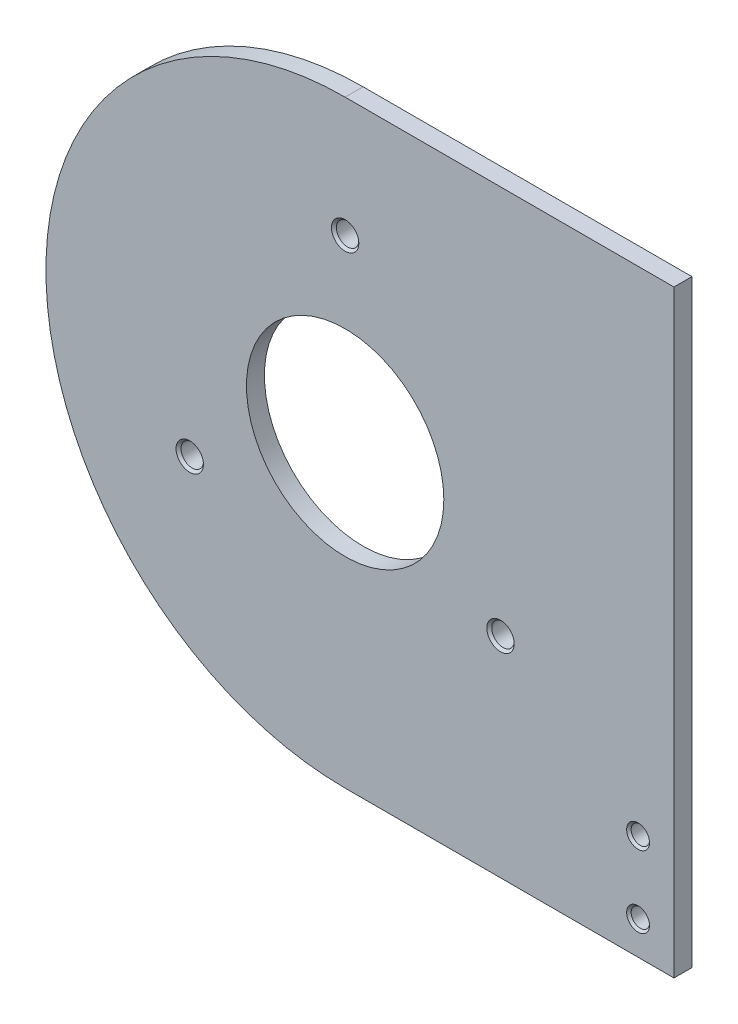
ISO-10303-21;
HEADER;
FILE_DESCRIPTION(('STEP AP214'),'2;1');
FILE_NAME('part.step','',(''),(''),'','','');
FILE_SCHEMA(('AUTOMOTIVE_DESIGN { 1 0 10303 214 1 1 1 1 }'));
ENDSEC;
DATA;
#1=APPLICATION_CONTEXT('core data for automotive mechanical design processes');
#2=APPLICATION_PROTOCOL_DEFINITION('international standard','automotive_design',2000,#1);
#3=PRODUCT_CONTEXT('',#1,'mechanical');
#4=PRODUCT('Part','Part','',(#3));
#5=PRODUCT_RELATED_PRODUCT_CATEGORY('part','',(#4));
#6=PRODUCT_DEFINITION_FORMATION('','',#4);
#7=PRODUCT_DEFINITION_CONTEXT('part definition',#1,'design');
#8=PRODUCT_DEFINITION('design','',#6,#7);
#9=PRODUCT_DEFINITION_SHAPE('','',#8);
#10=(LENGTH_UNIT() NAMED_UNIT(*) SI_UNIT(.MILLI.,.METRE.));
#11=(NAMED_UNIT(*) PLANE_ANGLE_UNIT() SI_UNIT($,.RADIAN.));
#12=(NAMED_UNIT(*) SI_UNIT($,.STERADIAN.) SOLID_ANGLE_UNIT());
#13=UNCERTAINTY_MEASURE_WITH_UNIT(LENGTH_MEASURE(1.E-05),#10,'distance_accuracy_value','');
#14=(GEOMETRIC_REPRESENTATION_CONTEXT(3) GLOBAL_UNCERTAINTY_ASSIGNED_CONTEXT((#13)) GLOBAL_UNIT_ASSIGNED_CONTEXT((#10,
#11,#12)) REPRESENTATION_CONTEXT('',''));
#15=CARTESIAN_POINT('',(0.,0.,0.));
#16=DIRECTION('',(0.,0.,1.));
#17=DIRECTION('',(1.,0.,0.));
#18=AXIS2_PLACEMENT_3D('',#15,#16,#17);
#19=CARTESIAN_POINT('',(0.,82.,0.));
#20=DIRECTION('',(0.,1.,0.));
#21=DIRECTION('',(0.,0.,1.));
#22=AXIS2_PLACEMENT_3D('',#19,#20,#21);
#23=PLANE('',#22);
#24=DIRECTION('',(0.,0.,1.));
#25=VECTOR('',#24,1.);
#26=CARTESIAN_POINT('',(-25.,82.,50.));
#27=LINE('',#26,#25);
#28=CARTESIAN_POINT('',(-25.,82.,6.));
#29=VERTEX_POINT('',#28);
#30=CARTESIAN_POINT('',(-25.,82.,8.));
#31=VERTEX_POINT('',#30);
#32=EDGE_CURVE('E140',#29,#31,#27,.T.);
#33=ORIENTED_EDGE('',*,*,#32,.F.);
#34=DIRECTION('',(1.,0.,0.));
#35=VECTOR('',#34,1.);
#36=CARTESIAN_POINT('',(-95.,82.,6.));
#37=LINE('',#36,#35);
#38=CARTESIAN_POINT('',(-61.65,82.,6.));
#39=VERTEX_POINT('',#38);
#40=EDGE_CURVE('E12',#39,#29,#37,.T.);
#41=ORIENTED_EDGE('',*,*,#40,.F.);
#42=DIRECTION('',(0.,0.,-1.));
#43=VECTOR('',#42,1.);
#44=CARTESIAN_POINT('',(-61.65,82.,8.00000000000001));
#45=LINE('',#44,#43);
#46=CARTESIAN_POINT('',(-61.65,82.,8.));
#47=VERTEX_POINT('',#46);
#48=EDGE_CURVE('E217',#47,#39,#45,.T.);
#49=ORIENTED_EDGE('',*,*,#48,.F.);
#50=DIRECTION('',(1.,0.,0.));
#51=VECTOR('',#50,1.);
#52=CARTESIAN_POINT('',(-95.,82.,8.));
#53=LINE('',#52,#51);
#54=EDGE_CURVE('E98',#47,#31,#53,.T.);
#55=ORIENTED_EDGE('',*,*,#54,.T.);
#56=EDGE_LOOP('',(#33,#41,#49,#55));
#57=FACE_BOUND('',#56,.T.);
#58=ADVANCED_FACE('F95',(#57),#23,.T.);
#59=CARTESIAN_POINT('',(-95.,82.,6.));
#60=DIRECTION('',(0.,0.,1.));
#61=DIRECTION('',(0.,-1.,0.));
#62=AXIS2_PLACEMENT_3D('',#59,#60,#61);
#63=PLANE('',#62);
#64=CARTESIAN_POINT('',(-29.,27.,6.00000000000001));
#65=DIRECTION('',(0.,0.,1.));
#66=DIRECTION('',(1.,0.,0.));
#67=AXIS2_PLACEMENT_3D('',#64,#65,#66);
#68=CIRCLE('',#67,1.02499999999999);
#69=CARTESIAN_POINT('',(-27.975,27.,6.00000000000001));
#70=VERTEX_POINT('',#69);
#71=EDGE_CURVE('E284',#70,#70,#68,.T.);
#72=ORIENTED_EDGE('',*,*,#71,.T.);
#73=EDGE_LOOP('',(#72));
#74=FACE_BOUND('',#73,.T.);
#75=CARTESIAN_POINT('',(-29.,19.,6.00000000000001));
#76=DIRECTION('',(0.,0.,1.));
#77=DIRECTION('',(1.,0.,0.));
#78=AXIS2_PLACEMENT_3D('',#75,#76,#77);
#79=CIRCLE('',#78,1.02499999999999);
#80=CARTESIAN_POINT('',(-27.975,19.,6.00000000000001));
#81=VERTEX_POINT('',#80);
#82=EDGE_CURVE('E151',#81,#81,#79,.T.);
#83=ORIENTED_EDGE('',*,*,#82,.T.);
#84=EDGE_LOOP('',(#83));
#85=FACE_BOUND('',#84,.T.);
#86=CARTESIAN_POINT('',(-61.65,48.65,6.00000000000001));
#87=DIRECTION('',(0.,0.,1.));
#88=DIRECTION('',(0.,-1.,0.));
#89=AXIS2_PLACEMENT_3D('',#86,#87,#88);
#90=CIRCLE('',#89,11.);
#91=CARTESIAN_POINT('',(-50.65,48.65,6.));
#92=VERTEX_POINT('',#91);
#93=EDGE_CURVE('E294',#92,#92,#90,.F.);
#94=ORIENTED_EDGE('',*,*,#93,.F.);
#95=EDGE_LOOP('',(#94));
#96=FACE_BOUND('',#95,.T.);
#97=CARTESIAN_POINT('',(-61.65,68.65,6.));
#98=DIRECTION('',(0.,0.,1.));
#99=DIRECTION('',(0.,-1.,0.));
#100=AXIS2_PLACEMENT_3D('',#97,#98,#99);
#101=CIRCLE('',#100,1.25);
#102=CARTESIAN_POINT('',(-61.65,67.4,6.));
#103=VERTEX_POINT('',#102);
#104=EDGE_CURVE('E302',#103,#103,#101,.T.);
#105=ORIENTED_EDGE('',*,*,#104,.T.);
#106=EDGE_LOOP('',(#105));
#107=FACE_BOUND('',#106,.T.);
#108=CARTESIAN_POINT('',(-44.3294919243113,38.6499999999999,6.00000000000001));
#109=DIRECTION('',(0.,0.,1.));
#110=DIRECTION('',(0.,-1.,0.));
#111=AXIS2_PLACEMENT_3D('',#108,#109,#110);
#112=CIRCLE('',#111,1.25);
#113=CARTESIAN_POINT('',(-44.3294919243113,37.3999999999999,6.00000000000001));
#114=VERTEX_POINT('',#113);
#115=EDGE_CURVE('E203',#114,#114,#112,.T.);
#116=ORIENTED_EDGE('',*,*,#115,.T.);
#117=EDGE_LOOP('',(#116));
#118=FACE_BOUND('',#117,.T.);
#119=CARTESIAN_POINT('',(-78.9705080756889,38.6500000000002,6.00000000000001));
#120=DIRECTION('',(0.,0.,1.));
#121=DIRECTION('',(0.,-1.,0.));
#122=AXIS2_PLACEMENT_3D('',#119,#120,#121);
#123=CIRCLE('',#122,1.25);
#124=CARTESIAN_POINT('',(-78.9705080756889,37.4000000000002,6.00000000000001));
#125=VERTEX_POINT('',#124);
#126=EDGE_CURVE('E206',#125,#125,#123,.T.);
#127=ORIENTED_EDGE('',*,*,#126,.T.);
#128=EDGE_LOOP('',(#127));
#129=FACE_BOUND('',#128,.T.);
#130=CARTESIAN_POINT('',(-61.65,48.65,6.));
#131=DIRECTION('',(0.,0.,1.));
#132=DIRECTION('',(0.,-1.,0.));
#133=AXIS2_PLACEMENT_3D('',#130,#131,#132);
#134=CIRCLE('',#133,33.35);
#135=CARTESIAN_POINT('',(-61.65,15.3,6.00000000000001));
#136=VERTEX_POINT('',#135);
#137=EDGE_CURVE('E110',#39,#136,#134,.T.);
#138=ORIENTED_EDGE('',*,*,#137,.F.);
#139=ORIENTED_EDGE('',*,*,#40,.T.);
#140=DIRECTION('',(0.,-1.,0.));
#141=VECTOR('',#140,1.);
#142=CARTESIAN_POINT('',(-25.,82.,6.));
#143=LINE('',#142,#141);
#144=CARTESIAN_POINT('',(-25.,15.3,6.00000000000001));
#145=VERTEX_POINT('',#144);
#146=EDGE_CURVE('E137',#29,#145,#143,.T.);
#147=ORIENTED_EDGE('',*,*,#146,.T.);
#148=DIRECTION('',(1.,0.,0.));
#149=VECTOR('',#148,1.);
#150=CARTESIAN_POINT('',(-95.,15.3,6.00000000000001));
#151=LINE('',#150,#149);
#152=EDGE_CURVE('E103',#136,#145,#151,.T.);
#153=ORIENTED_EDGE('',*,*,#152,.F.);
#154=EDGE_LOOP('',(#138,#139,#147,#153));
#155=FACE_BOUND('',#154,.T.);
#156=ADVANCED_FACE('F153',(#74,#85,#96,#107,#118,#129,#155),#63,.F.);
#157=CARTESIAN_POINT('',(-95.,15.3,6.00000000000001));
#158=DIRECTION('',(0.,1.,0.));
#159=DIRECTION('',(0.,0.,1.));
#160=AXIS2_PLACEMENT_3D('',#157,#158,#159);
#161=PLANE('',#160);
#162=DIRECTION('',(1.,0.,0.));
#163=VECTOR('',#162,1.);
#164=CARTESIAN_POINT('',(-95.,15.3,8.00000000000001));
#165=LINE('',#164,#163);
#166=CARTESIAN_POINT('',(-61.65,15.3,8.00000000000001));
#167=VERTEX_POINT('',#166);
#168=CARTESIAN_POINT('',(-25.,15.3,8.00000000000001));
#169=VERTEX_POINT('',#168);
#170=EDGE_CURVE('E225',#167,#169,#165,.T.);
#171=ORIENTED_EDGE('',*,*,#170,.F.);
#172=DIRECTION('',(0.,0.,-1.));
#173=VECTOR('',#172,1.);
#174=CARTESIAN_POINT('',(-61.65,15.3,8.00000000000001));
#175=LINE('',#174,#173);
#176=EDGE_CURVE('E215',#167,#136,#175,.T.);
#177=ORIENTED_EDGE('',*,*,#176,.T.);
#178=ORIENTED_EDGE('',*,*,#152,.T.);
#179=DIRECTION('',(0.,0.,1.));
#180=VECTOR('',#179,1.);
#181=CARTESIAN_POINT('',(-25.,15.3,6.00000000000001));
#182=LINE('',#181,#180);
#183=EDGE_CURVE('E143',#145,#169,#182,.T.);
#184=ORIENTED_EDGE('',*,*,#183,.T.);
#185=EDGE_LOOP('',(#171,#177,#178,#184));
#186=FACE_BOUND('',#185,.T.);
#187=ADVANCED_FACE('F155',(#186),#161,.F.);
#188=CARTESIAN_POINT('',(-95.,82.,8.));
#189=DIRECTION('',(0.,0.,1.));
#190=DIRECTION('',(0.,-1.,0.));
#191=AXIS2_PLACEMENT_3D('',#188,#189,#190);
#192=PLANE('',#191);
#193=CARTESIAN_POINT('',(-29.,27.,8.00000000000001));
#194=DIRECTION('',(0.,0.,1.));
#195=DIRECTION('',(1.,0.,0.));
#196=AXIS2_PLACEMENT_3D('',#193,#194,#195);
#197=CIRCLE('',#196,1.275);
#198=CARTESIAN_POINT('',(-27.725,27.,8.00000000000001));
#199=VERTEX_POINT('',#198);
#200=EDGE_CURVE('E182',#199,#199,#197,.T.);
#201=ORIENTED_EDGE('',*,*,#200,.F.);
#202=EDGE_LOOP('',(#201));
#203=FACE_BOUND('',#202,.T.);
#204=CARTESIAN_POINT('',(-29.,19.,8.00000000000001));
#205=DIRECTION('',(0.,0.,1.));
#206=DIRECTION('',(1.,0.,0.));
#207=AXIS2_PLACEMENT_3D('',#204,#205,#206);
#208=CIRCLE('',#207,1.275);
#209=CARTESIAN_POINT('',(-27.725,19.,8.00000000000001));
#210=VERTEX_POINT('',#209);
#211=EDGE_CURVE('E186',#210,#210,#208,.T.);
#212=ORIENTED_EDGE('',*,*,#211,.F.);
#213=EDGE_LOOP('',(#212));
#214=FACE_BOUND('',#213,.T.);
#215=CARTESIAN_POINT('',(-61.65,48.65,8.00000000000001));
#216=DIRECTION('',(0.,0.,1.));
#217=DIRECTION('',(1.,0.,0.));
#218=AXIS2_PLACEMENT_3D('',#215,#216,#217);
#219=CIRCLE('',#218,11.);
#220=CARTESIAN_POINT('',(-50.65,48.65,8.00000000000001));
#221=VERTEX_POINT('',#220);
#222=EDGE_CURVE('E150',#221,#221,#219,.T.);
#223=ORIENTED_EDGE('',*,*,#222,.F.);
#224=EDGE_LOOP('',(#223));
#225=FACE_BOUND('',#224,.T.);
#226=CARTESIAN_POINT('',(-61.65,68.65,8.00000000000001));
#227=DIRECTION('',(0.,0.,1.));
#228=DIRECTION('',(1.,0.,0.));
#229=AXIS2_PLACEMENT_3D('',#226,#227,#228);
#230=CIRCLE('',#229,1.525);
#231=CARTESIAN_POINT('',(-60.125,68.65,8.00000000000001));
#232=VERTEX_POINT('',#231);
#233=EDGE_CURVE('E193',#232,#232,#230,.T.);
#234=ORIENTED_EDGE('',*,*,#233,.F.);
#235=EDGE_LOOP('',(#234));
#236=FACE_BOUND('',#235,.T.);
#237=CARTESIAN_POINT('',(-44.3294919243113,38.6499999999999,8.00000000000001));
#238=DIRECTION('',(0.,0.,1.));
#239=DIRECTION('',(1.,0.,0.));
#240=AXIS2_PLACEMENT_3D('',#237,#238,#239);
#241=CIRCLE('',#240,1.525);
#242=CARTESIAN_POINT('',(-42.8044919243113,38.6499999999999,8.00000000000001));
#243=VERTEX_POINT('',#242);
#244=EDGE_CURVE('E197',#243,#243,#241,.T.);
#245=ORIENTED_EDGE('',*,*,#244,.F.);
#246=EDGE_LOOP('',(#245));
#247=FACE_BOUND('',#246,.T.);
#248=CARTESIAN_POINT('',(-78.9705080756889,38.6500000000002,8.00000000000001));
#249=DIRECTION('',(0.,0.,1.));
#250=DIRECTION('',(1.,0.,0.));
#251=AXIS2_PLACEMENT_3D('',#248,#249,#250);
#252=CIRCLE('',#251,1.525);
#253=CARTESIAN_POINT('',(-77.4455080756889,38.6500000000002,8.00000000000001));
#254=VERTEX_POINT('',#253);
#255=EDGE_CURVE('E200',#254,#254,#252,.T.);
#256=ORIENTED_EDGE('',*,*,#255,.F.);
#257=EDGE_LOOP('',(#256));
#258=FACE_BOUND('',#257,.T.);
#259=CARTESIAN_POINT('',(-61.65,48.65,8.00000000000001));
#260=DIRECTION('',(0.,0.,-1.));
#261=DIRECTION('',(1.,0.,0.));
#262=AXIS2_PLACEMENT_3D('',#259,#260,#261);
#263=CIRCLE('',#262,33.35);
#264=EDGE_CURVE('E118',#167,#47,#263,.T.);
#265=ORIENTED_EDGE('',*,*,#264,.F.);
#266=ORIENTED_EDGE('',*,*,#170,.T.);
#267=DIRECTION('',(0.,-1.,0.));
#268=VECTOR('',#267,1.);
#269=CARTESIAN_POINT('',(-25.,82.,8.));
#270=LINE('',#269,#268);
#271=EDGE_CURVE('E222',#31,#169,#270,.T.);
#272=ORIENTED_EDGE('',*,*,#271,.F.);
#273=ORIENTED_EDGE('',*,*,#54,.F.);
#274=EDGE_LOOP('',(#265,#266,#272,#273));
#275=FACE_BOUND('',#274,.T.);
#276=ADVANCED_FACE('F163',(#203,#214,#225,#236,#247,#258,#275),#192,.T.);
#277=CARTESIAN_POINT('',(-61.65,48.65,8.00000000000001));
#278=DIRECTION('',(0.,0.,-1.));
#279=DIRECTION('',(-1.,0.,0.));
#280=AXIS2_PLACEMENT_3D('',#277,#278,#279);
#281=CYLINDRICAL_SURFACE('',#280,33.35);
#282=ORIENTED_EDGE('',*,*,#264,.T.);
#283=ORIENTED_EDGE('',*,*,#48,.T.);
#284=ORIENTED_EDGE('',*,*,#137,.T.);
#285=ORIENTED_EDGE('',*,*,#176,.F.);
#286=EDGE_LOOP('',(#282,#283,#284,#285));
#287=FACE_BOUND('',#286,.T.);
#288=ADVANCED_FACE('F170',(#287),#281,.T.);
#289=CARTESIAN_POINT('',(-78.9705080756889,38.6500000000002,8.00000000000001));
#290=DIRECTION('',(0.,0.,1.));
#291=DIRECTION('',(1.,0.,0.));
#292=AXIS2_PLACEMENT_3D('',#289,#290,#291);
#293=CYLINDRICAL_SURFACE('',#292,1.25);
#294=ORIENTED_EDGE('',*,*,#126,.F.);
#295=EDGE_LOOP('',(#294));
#296=FACE_BOUND('',#295,.T.);
#297=CARTESIAN_POINT('',(-78.9705080756889,38.6500000000002,7.72500000000001));
#298=DIRECTION('',(0.,0.,1.));
#299=DIRECTION('',(1.,0.,0.));
#300=AXIS2_PLACEMENT_3D('',#297,#298,#299);
#301=CIRCLE('',#300,1.25);
#302=CARTESIAN_POINT('',(-77.7205080756889,38.6500000000002,7.72500000000001));
#303=VERTEX_POINT('',#302);
#304=EDGE_CURVE('E202',#303,#303,#301,.T.);
#305=ORIENTED_EDGE('',*,*,#304,.T.);
#306=EDGE_LOOP('',(#305));
#307=FACE_BOUND('',#306,.T.);
#308=ADVANCED_FACE('F177',(#296,#307),#293,.F.);
#309=CARTESIAN_POINT('',(-78.9705080756889,38.6500000000002,8.00000000000001));
#310=DIRECTION('',(0.,0.,1.));
#311=DIRECTION('',(1.,0.,0.));
#312=AXIS2_PLACEMENT_3D('',#309,#310,#311);
#313=CONICAL_SURFACE('',#312,1.525,0.785398163397445);
#314=ORIENTED_EDGE('',*,*,#304,.F.);
#315=EDGE_LOOP('',(#314));
#316=FACE_BOUND('',#315,.T.);
#317=ORIENTED_EDGE('',*,*,#255,.T.);
#318=EDGE_LOOP('',(#317));
#319=FACE_BOUND('',#318,.T.);
#320=ADVANCED_FACE('F232',(#316,#319),#313,.F.);
#321=CARTESIAN_POINT('',(-44.3294919243113,38.6499999999999,8.00000000000001));
#322=DIRECTION('',(0.,0.,1.));
#323=DIRECTION('',(1.,0.,0.));
#324=AXIS2_PLACEMENT_3D('',#321,#322,#323);
#325=CYLINDRICAL_SURFACE('',#324,1.25);
#326=ORIENTED_EDGE('',*,*,#115,.F.);
#327=EDGE_LOOP('',(#326));
#328=FACE_BOUND('',#327,.T.);
#329=CARTESIAN_POINT('',(-44.3294919243113,38.6499999999999,7.72500000000001));
#330=DIRECTION('',(0.,0.,1.));
#331=DIRECTION('',(1.,0.,0.));
#332=AXIS2_PLACEMENT_3D('',#329,#330,#331);
#333=CIRCLE('',#332,1.25);
#334=CARTESIAN_POINT('',(-43.0794919243113,38.6499999999999,7.72500000000001));
#335=VERTEX_POINT('',#334);
#336=EDGE_CURVE('E209',#335,#335,#333,.T.);
#337=ORIENTED_EDGE('',*,*,#336,.T.);
#338=EDGE_LOOP('',(#337));
#339=FACE_BOUND('',#338,.T.);
#340=ADVANCED_FACE('F236',(#328,#339),#325,.F.);
#341=CARTESIAN_POINT('',(-44.3294919243113,38.6499999999999,8.00000000000001));
#342=DIRECTION('',(0.,0.,1.));
#343=DIRECTION('',(1.,0.,0.));
#344=AXIS2_PLACEMENT_3D('',#341,#342,#343);
#345=CONICAL_SURFACE('',#344,1.525,0.785398163397445);
#346=ORIENTED_EDGE('',*,*,#336,.F.);
#347=EDGE_LOOP('',(#346));
#348=FACE_BOUND('',#347,.T.);
#349=ORIENTED_EDGE('',*,*,#244,.T.);
#350=EDGE_LOOP('',(#349));
#351=FACE_BOUND('',#350,.T.);
#352=ADVANCED_FACE('F243',(#348,#351),#345,.F.);
#353=CARTESIAN_POINT('',(-61.65,68.65,8.00000000000001));
#354=DIRECTION('',(0.,0.,1.));
#355=DIRECTION('',(1.,0.,0.));
#356=AXIS2_PLACEMENT_3D('',#353,#354,#355);
#357=CYLINDRICAL_SURFACE('',#356,1.25);
#358=ORIENTED_EDGE('',*,*,#104,.F.);
#359=EDGE_LOOP('',(#358));
#360=FACE_BOUND('',#359,.T.);
#361=CARTESIAN_POINT('',(-61.65,68.65,7.72500000000001));
#362=DIRECTION('',(0.,0.,1.));
#363=DIRECTION('',(1.,0.,0.));
#364=AXIS2_PLACEMENT_3D('',#361,#362,#363);
#365=CIRCLE('',#364,1.25);
#366=CARTESIAN_POINT('',(-60.4,68.65,7.72500000000001));
#367=VERTEX_POINT('',#366);
#368=EDGE_CURVE('E299',#367,#367,#365,.T.);
#369=ORIENTED_EDGE('',*,*,#368,.T.);
#370=EDGE_LOOP('',(#369));
#371=FACE_BOUND('',#370,.T.);
#372=ADVANCED_FACE('F249',(#360,#371),#357,.F.);
#373=CARTESIAN_POINT('',(-61.65,68.65,8.00000000000001));
#374=DIRECTION('',(0.,0.,1.));
#375=DIRECTION('',(1.,0.,0.));
#376=AXIS2_PLACEMENT_3D('',#373,#374,#375);
#377=CONICAL_SURFACE('',#376,1.525,0.785398163397445);
#378=ORIENTED_EDGE('',*,*,#368,.F.);
#379=EDGE_LOOP('',(#378));
#380=FACE_BOUND('',#379,.T.);
#381=ORIENTED_EDGE('',*,*,#233,.T.);
#382=EDGE_LOOP('',(#381));
#383=FACE_BOUND('',#382,.T.);
#384=ADVANCED_FACE('F253',(#380,#383),#377,.F.);
#385=CARTESIAN_POINT('',(-61.65,48.65,-50.001));
#386=DIRECTION('',(0.,0.,1.));
#387=DIRECTION('',(1.,0.,0.));
#388=AXIS2_PLACEMENT_3D('',#385,#386,#387);
#389=CYLINDRICAL_SURFACE('',#388,11.);
#390=CARTESIAN_POINT('',(-50.65,48.65,8.00000000000001));
#391=CARTESIAN_POINT('',(-50.65,48.65,7.97916666666668));
#392=CARTESIAN_POINT('',(-50.65,48.65,7.95833333333335));
#393=CARTESIAN_POINT('',(-50.65,48.65,7.91666666666668));
#394=CARTESIAN_POINT('',(-50.65,48.65,7.89583333333335));
#395=CARTESIAN_POINT('',(-50.65,48.65,7.85416666666668));
#396=CARTESIAN_POINT('',(-50.65,48.65,7.83333333333335));
#397=CARTESIAN_POINT('',(-50.65,48.65,7.79166666666668));
#398=CARTESIAN_POINT('',(-50.65,48.65,7.77083333333335));
#399=CARTESIAN_POINT('',(-50.65,48.65,7.72916666666668));
#400=CARTESIAN_POINT('',(-50.65,48.65,7.70833333333335));
#401=CARTESIAN_POINT('',(-50.65,48.65,7.66666666666668));
#402=CARTESIAN_POINT('',(-50.65,48.65,7.64583333333335));
#403=CARTESIAN_POINT('',(-50.65,48.65,7.60416666666668));
#404=CARTESIAN_POINT('',(-50.65,48.65,7.58333333333335));
#405=CARTESIAN_POINT('',(-50.65,48.65,7.54166666666668));
#406=CARTESIAN_POINT('',(-50.65,48.65,7.52083333333335));
#407=CARTESIAN_POINT('',(-50.65,48.65,7.47916666666668));
#408=CARTESIAN_POINT('',(-50.65,48.65,7.45833333333334));
#409=CARTESIAN_POINT('',(-50.65,48.65,7.41666666666667));
#410=CARTESIAN_POINT('',(-50.65,48.65,7.39583333333334));
#411=CARTESIAN_POINT('',(-50.65,48.65,7.35416666666667));
#412=CARTESIAN_POINT('',(-50.65,48.65,7.33333333333334));
#413=CARTESIAN_POINT('',(-50.65,48.65,7.29166666666667));
#414=CARTESIAN_POINT('',(-50.65,48.65,7.27083333333334));
#415=CARTESIAN_POINT('',(-50.65,48.65,7.22916666666667));
#416=CARTESIAN_POINT('',(-50.65,48.65,7.20833333333334));
#417=CARTESIAN_POINT('',(-50.65,48.65,7.16666666666667));
#418=CARTESIAN_POINT('',(-50.65,48.65,7.14583333333334));
#419=CARTESIAN_POINT('',(-50.65,48.65,7.10416666666667));
#420=CARTESIAN_POINT('',(-50.65,48.65,7.08333333333334));
#421=CARTESIAN_POINT('',(-50.65,48.65,7.04166666666667));
#422=CARTESIAN_POINT('',(-50.65,48.65,7.02083333333334));
#423=CARTESIAN_POINT('',(-50.65,48.65,6.97916666666667));
#424=CARTESIAN_POINT('',(-50.65,48.65,6.95833333333334));
#425=CARTESIAN_POINT('',(-50.65,48.65,6.91666666666667));
#426=CARTESIAN_POINT('',(-50.65,48.65,6.89583333333334));
#427=CARTESIAN_POINT('',(-50.65,48.65,6.85416666666667));
#428=CARTESIAN_POINT('',(-50.65,48.65,6.83333333333334));
#429=CARTESIAN_POINT('',(-50.65,48.65,6.79166666666667));
#430=CARTESIAN_POINT('',(-50.65,48.65,6.77083333333334));
#431=CARTESIAN_POINT('',(-50.65,48.65,6.72916666666667));
#432=CARTESIAN_POINT('',(-50.65,48.65,6.70833333333334));
#433=CARTESIAN_POINT('',(-50.65,48.65,6.66666666666667));
#434=CARTESIAN_POINT('',(-50.65,48.65,6.64583333333334));
#435=CARTESIAN_POINT('',(-50.65,48.65,6.60416666666667));
#436=CARTESIAN_POINT('',(-50.65,48.65,6.58333333333334));
#437=CARTESIAN_POINT('',(-50.65,48.65,6.54166666666667));
#438=CARTESIAN_POINT('',(-50.65,48.65,6.52083333333333));
#439=CARTESIAN_POINT('',(-50.65,48.65,6.47916666666667));
#440=CARTESIAN_POINT('',(-50.65,48.65,6.45833333333333));
#441=CARTESIAN_POINT('',(-50.65,48.65,6.41666666666667));
#442=CARTESIAN_POINT('',(-50.65,48.65,6.39583333333333));
#443=CARTESIAN_POINT('',(-50.65,48.65,6.35416666666667));
#444=CARTESIAN_POINT('',(-50.65,48.65,6.33333333333333));
#445=CARTESIAN_POINT('',(-50.65,48.65,6.29166666666667));
#446=CARTESIAN_POINT('',(-50.65,48.65,6.27083333333333));
#447=CARTESIAN_POINT('',(-50.65,48.65,6.22916666666667));
#448=CARTESIAN_POINT('',(-50.65,48.65,6.20833333333333));
#449=CARTESIAN_POINT('',(-50.65,48.65,6.16666666666667));
#450=CARTESIAN_POINT('',(-50.65,48.65,6.14583333333333));
#451=CARTESIAN_POINT('',(-50.65,48.65,6.10416666666667));
#452=CARTESIAN_POINT('',(-50.65,48.65,6.08333333333333));
#453=CARTESIAN_POINT('',(-50.65,48.65,6.04166666666667));
#454=CARTESIAN_POINT('',(-50.65,48.65,6.02083333333333));
#455=CARTESIAN_POINT('',(-50.65,48.65,6.));
#456=B_SPLINE_CURVE_WITH_KNOTS('',3,(#390,#391,#392,#393,#394,#395,#396,#397,#398,#399,#400,
#401,#402,#403,#404,#405,#406,#407,#408,#409,#410,#411,#412,#413,#414,#415,#416,#417,#418,#419,
#420,#421,#422,#423,#424,#425,#426,#427,#428,#429,#430,#431,#432,#433,#434,#435,#436,#437,#438,
#439,#440,#441,#442,#443,#444,#445,#446,#447,#448,#449,#450,#451,#452,#453,#454,#455),
.UNSPECIFIED.,.F.,.F.,(4,2,2,2,2,2,2,2,2,2,2,2,2,2,2,2,2,2,2,2,2,2,2,2,2,2,2,2,2,2,2,2,4),(0.,
0.0625000000000001,0.125,0.1875,0.25,0.3125,0.375,0.4375,0.5,0.562500000000007,
0.625000000000008,0.687500000000008,0.750000000000008,0.812500000000008,0.875000000000008,
0.937500000000008,1.00000000000001,1.06250000000001,1.12500000000001,1.18750000000001,
1.25000000000001,1.31250000000001,1.37500000000001,1.43750000000001,1.50000000000002,
1.56250000000002,1.62500000000002,1.68750000000002,1.75000000000002,1.81250000000002,
1.87500000000002,1.93750000000002,2.00000000000002),.UNSPECIFIED.);
#457=EDGE_CURVE('BSEAM257',#221,#92,#456,.T.);
#458=ORIENTED_EDGE('',*,*,#222,.T.);
#459=ORIENTED_EDGE('',*,*,#93,.T.);
#460=ORIENTED_EDGE('',*,*,#457,.T.);
#461=ORIENTED_EDGE('',*,*,#457,.F.);
#462=EDGE_LOOP('',(#458,#460,#459,#461));
#463=FACE_BOUND('',#462,.T.);
#464=ADVANCED_FACE('F257',(#463),#389,.F.);
#465=CARTESIAN_POINT('',(-25.,0.,50.));
#466=DIRECTION('',(-1.,0.,0.));
#467=DIRECTION('',(0.,0.,1.));
#468=AXIS2_PLACEMENT_3D('',#465,#466,#467);
#469=PLANE('',#468);
#470=ORIENTED_EDGE('',*,*,#32,.T.);
#471=ORIENTED_EDGE('',*,*,#271,.T.);
#472=ORIENTED_EDGE('',*,*,#183,.F.);
#473=ORIENTED_EDGE('',*,*,#146,.F.);
#474=EDGE_LOOP('',(#470,#471,#472,#473));
#475=FACE_BOUND('',#474,.T.);
#476=ADVANCED_FACE('F139',(#475),#469,.F.);
#477=CARTESIAN_POINT('',(-29.,19.,8.00000000000001));
#478=DIRECTION('',(0.,0.,1.));
#479=DIRECTION('',(1.,0.,0.));
#480=AXIS2_PLACEMENT_3D('',#477,#478,#479);
#481=CYLINDRICAL_SURFACE('',#480,1.02499999999999);
#482=ORIENTED_EDGE('',*,*,#82,.F.);
#483=EDGE_LOOP('',(#482));
#484=FACE_BOUND('',#483,.T.);
#485=CARTESIAN_POINT('',(-29.,19.,7.75));
#486=DIRECTION('',(0.,0.,1.));
#487=DIRECTION('',(1.,0.,0.));
#488=AXIS2_PLACEMENT_3D('',#485,#486,#487);
#489=CIRCLE('',#488,1.02499999999999);
#490=CARTESIAN_POINT('',(-27.975,19.,7.75));
#491=VERTEX_POINT('',#490);
#492=EDGE_CURVE('E289',#491,#491,#489,.T.);
#493=ORIENTED_EDGE('',*,*,#492,.T.);
#494=EDGE_LOOP('',(#493));
#495=FACE_BOUND('',#494,.T.);
#496=ADVANCED_FACE('F263',(#484,#495),#481,.F.);
#497=CARTESIAN_POINT('',(-29.,19.,8.00000000000001));
#498=DIRECTION('',(0.,0.,1.));
#499=DIRECTION('',(1.,0.,0.));
#500=AXIS2_PLACEMENT_3D('',#497,#498,#499);
#501=CONICAL_SURFACE('',#500,1.275,0.785398163397438);
#502=ORIENTED_EDGE('',*,*,#492,.F.);
#503=EDGE_LOOP('',(#502));
#504=FACE_BOUND('',#503,.T.);
#505=ORIENTED_EDGE('',*,*,#211,.T.);
#506=EDGE_LOOP('',(#505));
#507=FACE_BOUND('',#506,.T.);
#508=ADVANCED_FACE('F265',(#504,#507),#501,.F.);
#509=CARTESIAN_POINT('',(-29.,27.,8.00000000000001));
#510=DIRECTION('',(0.,0.,1.));
#511=DIRECTION('',(1.,0.,0.));
#512=AXIS2_PLACEMENT_3D('',#509,#510,#511);
#513=CYLINDRICAL_SURFACE('',#512,1.02499999999999);
#514=ORIENTED_EDGE('',*,*,#71,.F.);
#515=EDGE_LOOP('',(#514));
#516=FACE_BOUND('',#515,.T.);
#517=CARTESIAN_POINT('',(-29.,27.,7.75));
#518=DIRECTION('',(0.,0.,1.));
#519=DIRECTION('',(1.,0.,0.));
#520=AXIS2_PLACEMENT_3D('',#517,#518,#519);
#521=CIRCLE('',#520,1.02499999999999);
#522=CARTESIAN_POINT('',(-27.975,27.,7.75));
#523=VERTEX_POINT('',#522);
#524=EDGE_CURVE('E282',#523,#523,#521,.T.);
#525=ORIENTED_EDGE('',*,*,#524,.T.);
#526=EDGE_LOOP('',(#525));
#527=FACE_BOUND('',#526,.T.);
#528=ADVANCED_FACE('F269',(#516,#527),#513,.F.);
#529=CARTESIAN_POINT('',(-29.,27.,8.00000000000001));
#530=DIRECTION('',(0.,0.,1.));
#531=DIRECTION('',(1.,0.,0.));
#532=AXIS2_PLACEMENT_3D('',#529,#530,#531);
#533=CONICAL_SURFACE('',#532,1.275,0.785398163397438);
#534=ORIENTED_EDGE('',*,*,#524,.F.);
#535=EDGE_LOOP('',(#534));
#536=FACE_BOUND('',#535,.T.);
#537=ORIENTED_EDGE('',*,*,#200,.T.);
#538=EDGE_LOOP('',(#537));
#539=FACE_BOUND('',#538,.T.);
#540=ADVANCED_FACE('F273',(#536,#539),#533,.F.);
#541=CLOSED_SHELL('',(#58,#156,#187,#276,#288,#308,#320,#340,#352,#372,#384,#464,#476,#496,#508,
#528,#540));
#542=MANIFOLD_SOLID_BREP('B2',#541);
#543=ADVANCED_BREP_SHAPE_REPRESENTATION('',(#18,#542),#14);
#544=SHAPE_DEFINITION_REPRESENTATION(#9,#543);
ENDSEC;
END-ISO-10303-21;
